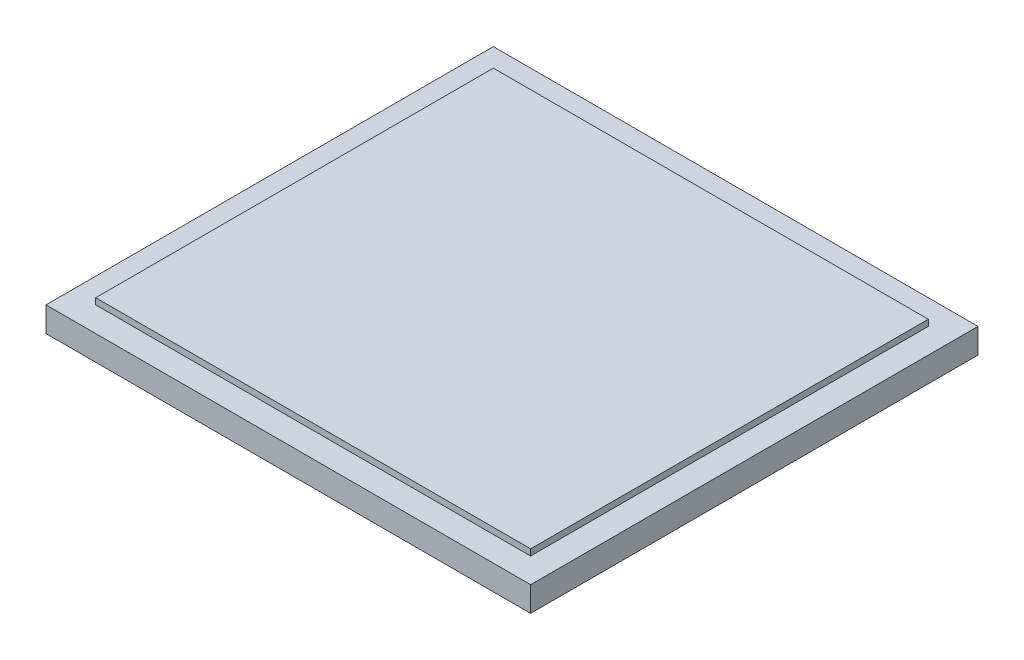
ISO-10303-21;
HEADER;
FILE_DESCRIPTION(('STEP AP214'),'2;1');
FILE_NAME('part.step','',(''),(''),'','','');
FILE_SCHEMA(('AUTOMOTIVE_DESIGN { 1 0 10303 214 1 1 1 1 }'));
ENDSEC;
DATA;
#1=APPLICATION_CONTEXT('core data for automotive mechanical design processes');
#2=APPLICATION_PROTOCOL_DEFINITION('international standard','automotive_design',2000,#1);
#3=PRODUCT_CONTEXT('',#1,'mechanical');
#4=PRODUCT('Part','Part','',(#3));
#5=PRODUCT_RELATED_PRODUCT_CATEGORY('part','',(#4));
#6=PRODUCT_DEFINITION_FORMATION('','',#4);
#7=PRODUCT_DEFINITION_CONTEXT('part definition',#1,'design');
#8=PRODUCT_DEFINITION('design','',#6,#7);
#9=PRODUCT_DEFINITION_SHAPE('','',#8);
#10=(LENGTH_UNIT() NAMED_UNIT(*) SI_UNIT(.MILLI.,.METRE.));
#11=(NAMED_UNIT(*) PLANE_ANGLE_UNIT() SI_UNIT($,.RADIAN.));
#12=(NAMED_UNIT(*) SI_UNIT($,.STERADIAN.) SOLID_ANGLE_UNIT());
#13=UNCERTAINTY_MEASURE_WITH_UNIT(LENGTH_MEASURE(1.E-05),#10,'distance_accuracy_value','');
#14=(GEOMETRIC_REPRESENTATION_CONTEXT(3) GLOBAL_UNCERTAINTY_ASSIGNED_CONTEXT((#13)) GLOBAL_UNIT_ASSIGNED_CONTEXT((#10,
#11,#12)) REPRESENTATION_CONTEXT('',''));
#15=CARTESIAN_POINT('',(0.,0.,0.));
#16=DIRECTION('',(0.,0.,1.));
#17=DIRECTION('',(1.,0.,0.));
#18=AXIS2_PLACEMENT_3D('',#15,#16,#17);
#19=CARTESIAN_POINT('',(0.,10.,0.));
#20=DIRECTION('',(0.,-1.,0.));
#21=DIRECTION('',(0.,0.,-1.));
#22=AXIS2_PLACEMENT_3D('',#19,#20,#21);
#23=PLANE('',#22);
#24=DIRECTION('',(0.,0.,1.));
#25=VECTOR('',#24,1.);
#26=CARTESIAN_POINT('',(0.,10.,0.));
#27=LINE('',#26,#25);
#28=CARTESIAN_POINT('',(0.,10.,-180.));
#29=VERTEX_POINT('',#28);
#30=CARTESIAN_POINT('',(0.,10.,0.));
#31=VERTEX_POINT('',#30);
#32=EDGE_CURVE('E133',#29,#31,#27,.T.);
#33=ORIENTED_EDGE('',*,*,#32,.T.);
#34=DIRECTION('',(1.,0.,0.));
#35=VECTOR('',#34,1.);
#36=CARTESIAN_POINT('',(0.,10.,0.));
#37=LINE('',#36,#35);
#38=CARTESIAN_POINT('',(195.,10.,0.));
#39=VERTEX_POINT('',#38);
#40=EDGE_CURVE('E136',#31,#39,#37,.T.);
#41=ORIENTED_EDGE('',*,*,#40,.T.);
#42=DIRECTION('',(0.,0.,-1.));
#43=VECTOR('',#42,1.);
#44=CARTESIAN_POINT('',(195.,10.,0.));
#45=LINE('',#44,#43);
#46=CARTESIAN_POINT('',(195.,10.,-180.));
#47=VERTEX_POINT('',#46);
#48=EDGE_CURVE('E139',#39,#47,#45,.T.);
#49=ORIENTED_EDGE('',*,*,#48,.T.);
#50=DIRECTION('',(-1.,0.,0.));
#51=VECTOR('',#50,1.);
#52=CARTESIAN_POINT('',(0.,10.,-180.));
#53=LINE('',#52,#51);
#54=EDGE_CURVE('E141',#47,#29,#53,.T.);
#55=ORIENTED_EDGE('',*,*,#54,.T.);
#56=EDGE_LOOP('',(#33,#41,#49,#55));
#57=FACE_BOUND('',#56,.T.);
#58=DIRECTION('',(-1.,0.,0.));
#59=VECTOR('',#58,1.);
#60=CARTESIAN_POINT('',(185.,10.,-170.));
#61=LINE('',#60,#59);
#62=CARTESIAN_POINT('',(185.,10.,-170.));
#63=VERTEX_POINT('',#62);
#64=CARTESIAN_POINT('',(10.,10.,-170.));
#65=VERTEX_POINT('',#64);
#66=EDGE_CURVE('E54',#63,#65,#61,.T.);
#67=ORIENTED_EDGE('',*,*,#66,.F.);
#68=DIRECTION('',(0.,0.,-1.));
#69=VECTOR('',#68,1.);
#70=CARTESIAN_POINT('',(185.,10.,-10.));
#71=LINE('',#70,#69);
#72=CARTESIAN_POINT('',(185.,10.,-10.));
#73=VERTEX_POINT('',#72);
#74=EDGE_CURVE('E58',#73,#63,#71,.T.);
#75=ORIENTED_EDGE('',*,*,#74,.F.);
#76=DIRECTION('',(1.,0.,0.));
#77=VECTOR('',#76,1.);
#78=CARTESIAN_POINT('',(10.,10.,-10.));
#79=LINE('',#78,#77);
#80=CARTESIAN_POINT('',(10.,10.,-10.));
#81=VERTEX_POINT('',#80);
#82=EDGE_CURVE('E251',#81,#73,#79,.T.);
#83=ORIENTED_EDGE('',*,*,#82,.F.);
#84=DIRECTION('',(0.,0.,1.));
#85=VECTOR('',#84,1.);
#86=CARTESIAN_POINT('',(10.,10.,-170.));
#87=LINE('',#86,#85);
#88=EDGE_CURVE('E257',#65,#81,#87,.T.);
#89=ORIENTED_EDGE('',*,*,#88,.F.);
#90=EDGE_LOOP('',(#67,#75,#83,#89));
#91=FACE_BOUND('',#90,.T.);
#92=ADVANCED_FACE('F39',(#57,#91),#23,.F.);
#93=CARTESIAN_POINT('',(0.,10.,0.));
#94=DIRECTION('',(1.,0.,0.));
#95=DIRECTION('',(0.,0.,-1.));
#96=AXIS2_PLACEMENT_3D('',#93,#94,#95);
#97=PLANE('',#96);
#98=DIRECTION('',(0.,0.,1.));
#99=VECTOR('',#98,1.);
#100=CARTESIAN_POINT('',(0.,0.,0.));
#101=LINE('',#100,#99);
#102=CARTESIAN_POINT('',(0.,0.,-180.));
#103=VERTEX_POINT('',#102);
#104=CARTESIAN_POINT('',(0.,0.,0.));
#105=VERTEX_POINT('',#104);
#106=EDGE_CURVE('E124',#103,#105,#101,.T.);
#107=ORIENTED_EDGE('',*,*,#106,.T.);
#108=DIRECTION('',(0.,-1.,0.));
#109=VECTOR('',#108,1.);
#110=CARTESIAN_POINT('',(0.,10.,0.));
#111=LINE('',#110,#109);
#112=EDGE_CURVE('E11',#31,#105,#111,.T.);
#113=ORIENTED_EDGE('',*,*,#112,.F.);
#114=ORIENTED_EDGE('',*,*,#32,.F.);
#115=DIRECTION('',(0.,-1.,0.));
#116=VECTOR('',#115,1.);
#117=CARTESIAN_POINT('',(0.,10.,-180.));
#118=LINE('',#117,#116);
#119=EDGE_CURVE('E142',#29,#103,#118,.T.);
#120=ORIENTED_EDGE('',*,*,#119,.T.);
#121=EDGE_LOOP('',(#107,#113,#114,#120));
#122=FACE_BOUND('',#121,.T.);
#123=ADVANCED_FACE('F41',(#122),#97,.F.);
#124=CARTESIAN_POINT('',(0.,10.,0.));
#125=DIRECTION('',(0.,0.,-1.));
#126=DIRECTION('',(-1.,0.,0.));
#127=AXIS2_PLACEMENT_3D('',#124,#125,#126);
#128=PLANE('',#127);
#129=DIRECTION('',(1.,0.,0.));
#130=VECTOR('',#129,1.);
#131=CARTESIAN_POINT('',(0.,0.,0.));
#132=LINE('',#131,#130);
#133=CARTESIAN_POINT('',(195.,0.,0.));
#134=VERTEX_POINT('',#133);
#135=EDGE_CURVE('E127',#105,#134,#132,.T.);
#136=ORIENTED_EDGE('',*,*,#135,.T.);
#137=DIRECTION('',(0.,-1.,0.));
#138=VECTOR('',#137,1.);
#139=CARTESIAN_POINT('',(195.,10.,0.));
#140=LINE('',#139,#138);
#141=EDGE_CURVE('E47',#39,#134,#140,.T.);
#142=ORIENTED_EDGE('',*,*,#141,.F.);
#143=ORIENTED_EDGE('',*,*,#40,.F.);
#144=ORIENTED_EDGE('',*,*,#112,.T.);
#145=EDGE_LOOP('',(#136,#142,#143,#144));
#146=FACE_BOUND('',#145,.T.);
#147=ADVANCED_FACE('F172',(#146),#128,.F.);
#148=CARTESIAN_POINT('',(195.,10.,0.));
#149=DIRECTION('',(-1.,0.,0.));
#150=DIRECTION('',(0.,0.,1.));
#151=AXIS2_PLACEMENT_3D('',#148,#149,#150);
#152=PLANE('',#151);
#153=DIRECTION('',(0.,0.,-1.));
#154=VECTOR('',#153,1.);
#155=CARTESIAN_POINT('',(195.,0.,0.));
#156=LINE('',#155,#154);
#157=CARTESIAN_POINT('',(195.,0.,-180.));
#158=VERTEX_POINT('',#157);
#159=EDGE_CURVE('E145',#134,#158,#156,.T.);
#160=ORIENTED_EDGE('',*,*,#159,.T.);
#161=DIRECTION('',(0.,-1.,0.));
#162=VECTOR('',#161,1.);
#163=CARTESIAN_POINT('',(195.,10.,-180.));
#164=LINE('',#163,#162);
#165=EDGE_CURVE('E150',#47,#158,#164,.T.);
#166=ORIENTED_EDGE('',*,*,#165,.F.);
#167=ORIENTED_EDGE('',*,*,#48,.F.);
#168=ORIENTED_EDGE('',*,*,#141,.T.);
#169=EDGE_LOOP('',(#160,#166,#167,#168));
#170=FACE_BOUND('',#169,.T.);
#171=ADVANCED_FACE('F157',(#170),#152,.F.);
#172=CARTESIAN_POINT('',(0.,10.,-180.));
#173=DIRECTION('',(0.,0.,1.));
#174=DIRECTION('',(1.,0.,0.));
#175=AXIS2_PLACEMENT_3D('',#172,#173,#174);
#176=PLANE('',#175);
#177=DIRECTION('',(-1.,0.,0.));
#178=VECTOR('',#177,1.);
#179=CARTESIAN_POINT('',(0.,0.,-180.));
#180=LINE('',#179,#178);
#181=EDGE_CURVE('E137',#158,#103,#180,.T.);
#182=ORIENTED_EDGE('',*,*,#181,.T.);
#183=ORIENTED_EDGE('',*,*,#119,.F.);
#184=ORIENTED_EDGE('',*,*,#54,.F.);
#185=ORIENTED_EDGE('',*,*,#165,.T.);
#186=EDGE_LOOP('',(#182,#183,#184,#185));
#187=FACE_BOUND('',#186,.T.);
#188=ADVANCED_FACE('F166',(#187),#176,.F.);
#189=CARTESIAN_POINT('',(0.,0.,0.));
#190=DIRECTION('',(0.,-1.,0.));
#191=DIRECTION('',(0.,0.,-1.));
#192=AXIS2_PLACEMENT_3D('',#189,#190,#191);
#193=PLANE('',#192);
#194=ORIENTED_EDGE('',*,*,#106,.F.);
#195=ORIENTED_EDGE('',*,*,#181,.F.);
#196=ORIENTED_EDGE('',*,*,#159,.F.);
#197=ORIENTED_EDGE('',*,*,#135,.F.);
#198=EDGE_LOOP('',(#194,#195,#196,#197));
#199=FACE_BOUND('',#198,.T.);
#200=ADVANCED_FACE('F163',(#199),#193,.T.);
#201=CARTESIAN_POINT('',(185.,12.5,-170.));
#202=DIRECTION('',(0.,0.,1.));
#203=DIRECTION('',(1.,0.,0.));
#204=AXIS2_PLACEMENT_3D('',#201,#202,#203);
#205=PLANE('',#204);
#206=ORIENTED_EDGE('',*,*,#66,.T.);
#207=DIRECTION('',(0.,-1.,0.));
#208=VECTOR('',#207,1.);
#209=CARTESIAN_POINT('',(10.,12.5,-170.));
#210=LINE('',#209,#208);
#211=CARTESIAN_POINT('',(10.,12.5,-170.));
#212=VERTEX_POINT('',#211);
#213=EDGE_CURVE('E107',#212,#65,#210,.T.);
#214=ORIENTED_EDGE('',*,*,#213,.F.);
#215=DIRECTION('',(-1.,0.,0.));
#216=VECTOR('',#215,1.);
#217=CARTESIAN_POINT('',(185.,12.5,-170.));
#218=LINE('',#217,#216);
#219=CARTESIAN_POINT('',(185.,12.5,-170.));
#220=VERTEX_POINT('',#219);
#221=EDGE_CURVE('E113',#220,#212,#218,.T.);
#222=ORIENTED_EDGE('',*,*,#221,.F.);
#223=DIRECTION('',(0.,-1.,0.));
#224=VECTOR('',#223,1.);
#225=CARTESIAN_POINT('',(185.,12.5,-170.));
#226=LINE('',#225,#224);
#227=EDGE_CURVE('E249',#220,#63,#226,.T.);
#228=ORIENTED_EDGE('',*,*,#227,.T.);
#229=EDGE_LOOP('',(#206,#214,#222,#228));
#230=FACE_BOUND('',#229,.T.);
#231=ADVANCED_FACE('F123',(#230),#205,.F.);
#232=CARTESIAN_POINT('',(10.,12.5,-170.));
#233=DIRECTION('',(1.,0.,0.));
#234=DIRECTION('',(0.,0.,-1.));
#235=AXIS2_PLACEMENT_3D('',#232,#233,#234);
#236=PLANE('',#235);
#237=ORIENTED_EDGE('',*,*,#88,.T.);
#238=DIRECTION('',(0.,-1.,0.));
#239=VECTOR('',#238,1.);
#240=CARTESIAN_POINT('',(10.,12.5,-10.));
#241=LINE('',#240,#239);
#242=CARTESIAN_POINT('',(10.,12.5,-10.));
#243=VERTEX_POINT('',#242);
#244=EDGE_CURVE('E109',#243,#81,#241,.T.);
#245=ORIENTED_EDGE('',*,*,#244,.F.);
#246=DIRECTION('',(0.,0.,1.));
#247=VECTOR('',#246,1.);
#248=CARTESIAN_POINT('',(10.,12.5,-170.));
#249=LINE('',#248,#247);
#250=EDGE_CURVE('E102',#212,#243,#249,.T.);
#251=ORIENTED_EDGE('',*,*,#250,.F.);
#252=ORIENTED_EDGE('',*,*,#213,.T.);
#253=EDGE_LOOP('',(#237,#245,#251,#252));
#254=FACE_BOUND('',#253,.T.);
#255=ADVANCED_FACE('F105',(#254),#236,.F.);
#256=CARTESIAN_POINT('',(10.,12.5,-10.));
#257=DIRECTION('',(0.,0.,-1.));
#258=DIRECTION('',(-1.,0.,0.));
#259=AXIS2_PLACEMENT_3D('',#256,#257,#258);
#260=PLANE('',#259);
#261=ORIENTED_EDGE('',*,*,#82,.T.);
#262=DIRECTION('',(0.,-1.,0.));
#263=VECTOR('',#262,1.);
#264=CARTESIAN_POINT('',(185.,12.5,-10.));
#265=LINE('',#264,#263);
#266=CARTESIAN_POINT('',(185.,12.5,-10.));
#267=VERTEX_POINT('',#266);
#268=EDGE_CURVE('E129',#267,#73,#265,.T.);
#269=ORIENTED_EDGE('',*,*,#268,.F.);
#270=DIRECTION('',(1.,0.,0.));
#271=VECTOR('',#270,1.);
#272=CARTESIAN_POINT('',(10.,12.5,-10.));
#273=LINE('',#272,#271);
#274=EDGE_CURVE('E112',#243,#267,#273,.T.);
#275=ORIENTED_EDGE('',*,*,#274,.F.);
#276=ORIENTED_EDGE('',*,*,#244,.T.);
#277=EDGE_LOOP('',(#261,#269,#275,#276));
#278=FACE_BOUND('',#277,.T.);
#279=ADVANCED_FACE('F219',(#278),#260,.F.);
#280=CARTESIAN_POINT('',(185.,12.5,-10.));
#281=DIRECTION('',(-1.,0.,0.));
#282=DIRECTION('',(0.,0.,1.));
#283=AXIS2_PLACEMENT_3D('',#280,#281,#282);
#284=PLANE('',#283);
#285=ORIENTED_EDGE('',*,*,#74,.T.);
#286=ORIENTED_EDGE('',*,*,#227,.F.);
#287=DIRECTION('',(0.,0.,-1.));
#288=VECTOR('',#287,1.);
#289=CARTESIAN_POINT('',(185.,12.5,-10.));
#290=LINE('',#289,#288);
#291=EDGE_CURVE('E118',#267,#220,#290,.T.);
#292=ORIENTED_EDGE('',*,*,#291,.F.);
#293=ORIENTED_EDGE('',*,*,#268,.T.);
#294=EDGE_LOOP('',(#285,#286,#292,#293));
#295=FACE_BOUND('',#294,.T.);
#296=ADVANCED_FACE('F227',(#295),#284,.F.);
#297=CARTESIAN_POINT('',(0.,12.5,0.));
#298=DIRECTION('',(0.,1.,0.));
#299=DIRECTION('',(0.,0.,1.));
#300=AXIS2_PLACEMENT_3D('',#297,#298,#299);
#301=PLANE('',#300);
#302=ORIENTED_EDGE('',*,*,#221,.T.);
#303=ORIENTED_EDGE('',*,*,#250,.T.);
#304=ORIENTED_EDGE('',*,*,#274,.T.);
#305=ORIENTED_EDGE('',*,*,#291,.T.);
#306=EDGE_LOOP('',(#302,#303,#304,#305));
#307=FACE_BOUND('',#306,.T.);
#308=ADVANCED_FACE('F116',(#307),#301,.T.);
#309=CLOSED_SHELL('',(#92,#123,#147,#171,#188,#200,#231,#255,#279,#296,#308));
#310=MANIFOLD_SOLID_BREP('B2',#309);
#311=ADVANCED_BREP_SHAPE_REPRESENTATION('',(#18,#310),#14);
#312=SHAPE_DEFINITION_REPRESENTATION(#9,#311);
ENDSEC;
END-ISO-10303-21;
